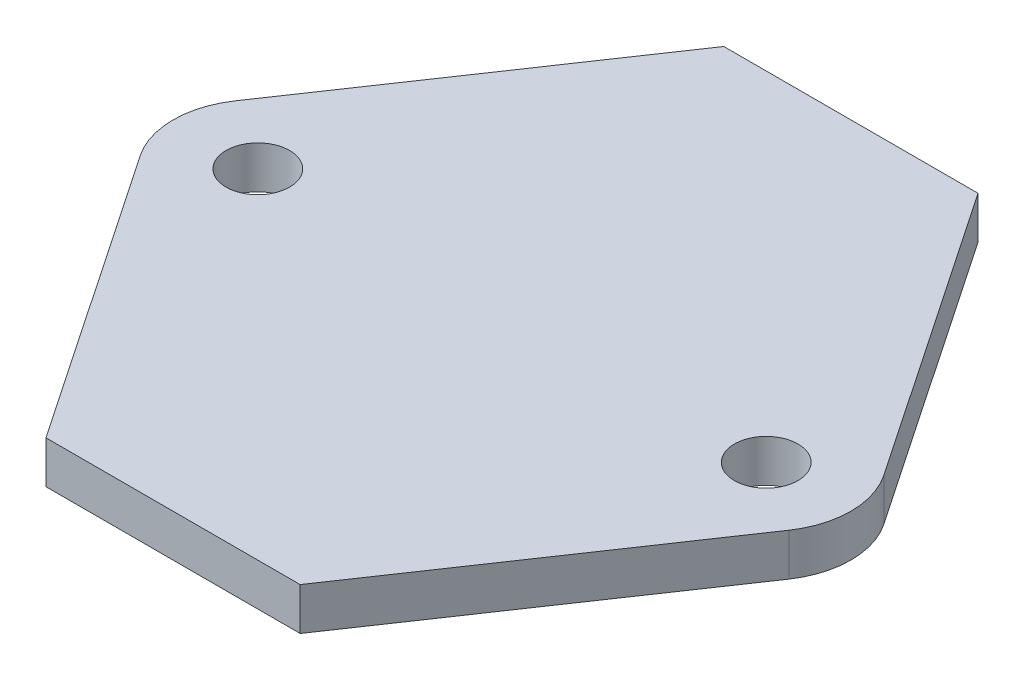
ISO-10303-21;
HEADER;
FILE_DESCRIPTION(('STEP AP214'),'2;1');
FILE_NAME('part.step','',(''),(''),'','','');
FILE_SCHEMA(('AUTOMOTIVE_DESIGN { 1 0 10303 214 1 1 1 1 }'));
ENDSEC;
DATA;
#1=APPLICATION_CONTEXT('core data for automotive mechanical design processes');
#2=APPLICATION_PROTOCOL_DEFINITION('international standard','automotive_design',2000,#1);
#3=PRODUCT_CONTEXT('',#1,'mechanical');
#4=PRODUCT('Part','Part','',(#3));
#5=PRODUCT_RELATED_PRODUCT_CATEGORY('part','',(#4));
#6=PRODUCT_DEFINITION_FORMATION('','',#4);
#7=PRODUCT_DEFINITION_CONTEXT('part definition',#1,'design');
#8=PRODUCT_DEFINITION('design','',#6,#7);
#9=PRODUCT_DEFINITION_SHAPE('','',#8);
#10=(LENGTH_UNIT() NAMED_UNIT(*) SI_UNIT(.MILLI.,.METRE.));
#11=(NAMED_UNIT(*) PLANE_ANGLE_UNIT() SI_UNIT($,.RADIAN.));
#12=(NAMED_UNIT(*) SI_UNIT($,.STERADIAN.) SOLID_ANGLE_UNIT());
#13=UNCERTAINTY_MEASURE_WITH_UNIT(LENGTH_MEASURE(1.E-05),#10,'distance_accuracy_value','');
#14=(GEOMETRIC_REPRESENTATION_CONTEXT(3) GLOBAL_UNCERTAINTY_ASSIGNED_CONTEXT((#13)) GLOBAL_UNIT_ASSIGNED_CONTEXT((#10,
#11,#12)) REPRESENTATION_CONTEXT('',''));
#15=CARTESIAN_POINT('',(0.,0.,0.));
#16=DIRECTION('',(0.,0.,1.));
#17=DIRECTION('',(1.,0.,0.));
#18=AXIS2_PLACEMENT_3D('',#15,#16,#17);
#19=CARTESIAN_POINT('',(0.,1.5875,25.4));
#20=DIRECTION('',(0.,0.,-1.));
#21=DIRECTION('',(-1.,0.,0.));
#22=AXIS2_PLACEMENT_3D('',#19,#20,#21);
#23=PLANE('',#22);
#24=DIRECTION('',(1.,0.,0.));
#25=VECTOR('',#24,1.);
#26=CARTESIAN_POINT('',(0.,-1.5875,25.4));
#27=LINE('',#26,#25);
#28=CARTESIAN_POINT('',(-9.525,-1.5875,25.4));
#29=VERTEX_POINT('',#28);
#30=CARTESIAN_POINT('',(9.525,-1.5875,25.4));
#31=VERTEX_POINT('',#30);
#32=EDGE_CURVE('E139',#29,#31,#27,.T.);
#33=ORIENTED_EDGE('',*,*,#32,.T.);
#34=DIRECTION('',(0.,-1.,0.));
#35=VECTOR('',#34,1.);
#36=CARTESIAN_POINT('',(9.525,1.5875,25.4));
#37=LINE('',#36,#35);
#38=CARTESIAN_POINT('',(9.525,1.5875,25.4));
#39=VERTEX_POINT('',#38);
#40=EDGE_CURVE('E11',#39,#31,#37,.T.);
#41=ORIENTED_EDGE('',*,*,#40,.F.);
#42=DIRECTION('',(1.,0.,0.));
#43=VECTOR('',#42,1.);
#44=CARTESIAN_POINT('',(0.,1.5875,25.4));
#45=LINE('',#44,#43);
#46=CARTESIAN_POINT('',(-9.525,1.5875,25.4));
#47=VERTEX_POINT('',#46);
#48=EDGE_CURVE('E158',#47,#39,#45,.T.);
#49=ORIENTED_EDGE('',*,*,#48,.F.);
#50=DIRECTION('',(0.,-1.,0.));
#51=VECTOR('',#50,1.);
#52=CARTESIAN_POINT('',(-9.525,1.5875,25.4));
#53=LINE('',#52,#51);
#54=EDGE_CURVE('E59',#47,#29,#53,.T.);
#55=ORIENTED_EDGE('',*,*,#54,.T.);
#56=EDGE_LOOP('',(#33,#41,#49,#55));
#57=FACE_BOUND('',#56,.T.);
#58=ADVANCED_FACE('F43',(#57),#23,.F.);
#59=CARTESIAN_POINT('',(18.3228429748059,1.5875,12.4025026796232));
#60=DIRECTION('',(-0.828123163059515,0.,-0.560546186147318));
#61=DIRECTION('',(-0.560546186147318,0.,0.828123163059515));
#62=AXIS2_PLACEMENT_3D('',#59,#60,#61);
#63=PLANE('',#62);
#64=DIRECTION('',(0.560546186147318,0.,-0.828123163059515));
#65=VECTOR('',#64,1.);
#66=CARTESIAN_POINT('',(18.3228429748059,-1.5875,12.4025026796232));
#67=LINE('',#66,#65);
#68=CARTESIAN_POINT('',(24.3085820854279,-1.5875,3.55946828203547));
#69=VERTEX_POINT('',#68);
#70=EDGE_CURVE('E141',#31,#69,#67,.T.);
#71=ORIENTED_EDGE('',*,*,#70,.T.);
#72=DIRECTION('',(0.,-1.,0.));
#73=VECTOR('',#72,1.);
#74=CARTESIAN_POINT('',(24.3085820854279,1.5875,3.55946828203547));
#75=LINE('',#74,#73);
#76=CARTESIAN_POINT('',(24.3085820854279,1.5875,3.55946828203547));
#77=VERTEX_POINT('',#76);
#78=EDGE_CURVE('E51',#77,#69,#75,.T.);
#79=ORIENTED_EDGE('',*,*,#78,.F.);
#80=DIRECTION('',(0.560546186147318,0.,-0.828123163059515));
#81=VECTOR('',#80,1.);
#82=CARTESIAN_POINT('',(18.3228429748059,1.5875,12.4025026796232));
#83=LINE('',#82,#81);
#84=EDGE_CURVE('E97',#39,#77,#83,.T.);
#85=ORIENTED_EDGE('',*,*,#84,.F.);
#86=ORIENTED_EDGE('',*,*,#40,.T.);
#87=EDGE_LOOP('',(#71,#79,#85,#86));
#88=FACE_BOUND('',#87,.T.);
#89=ADVANCED_FACE('F221',(#88),#63,.F.);
#90=CARTESIAN_POINT('',(19.05,1.5875,0.));
#91=DIRECTION('',(0.,-1.,0.));
#92=DIRECTION('',(0.,0.,-1.));
#93=AXIS2_PLACEMENT_3D('',#90,#91,#92);
#94=CYLINDRICAL_SURFACE('',#93,6.35);
#95=CARTESIAN_POINT('',(19.05,-1.5875,0.));
#96=DIRECTION('',(0.,1.,0.));
#97=DIRECTION('',(0.,0.,1.));
#98=AXIS2_PLACEMENT_3D('',#95,#96,#97);
#99=CIRCLE('',#98,6.35);
#100=CARTESIAN_POINT('',(24.3085820854279,-1.5875,-3.55946828203547));
#101=VERTEX_POINT('',#100);
#102=EDGE_CURVE('E144',#69,#101,#99,.T.);
#103=ORIENTED_EDGE('',*,*,#102,.T.);
#104=DIRECTION('',(0.,-1.,0.));
#105=VECTOR('',#104,1.);
#106=CARTESIAN_POINT('',(24.3085820854279,1.5875,-3.55946828203547));
#107=LINE('',#106,#105);
#108=CARTESIAN_POINT('',(24.3085820854279,1.5875,-3.55946828203547));
#109=VERTEX_POINT('',#108);
#110=EDGE_CURVE('E164',#109,#101,#107,.T.);
#111=ORIENTED_EDGE('',*,*,#110,.F.);
#112=CARTESIAN_POINT('',(19.05,1.5875,0.));
#113=DIRECTION('',(0.,1.,0.));
#114=DIRECTION('',(0.,0.,1.));
#115=AXIS2_PLACEMENT_3D('',#112,#113,#114);
#116=CIRCLE('',#115,6.35);
#117=EDGE_CURVE('E172',#77,#109,#116,.T.);
#118=ORIENTED_EDGE('',*,*,#117,.F.);
#119=ORIENTED_EDGE('',*,*,#78,.T.);
#120=EDGE_LOOP('',(#103,#111,#118,#119));
#121=FACE_BOUND('',#120,.T.);
#122=ADVANCED_FACE('F170',(#121),#94,.T.);
#123=CARTESIAN_POINT('',(18.3228429748059,1.5875,-12.4025026796232));
#124=DIRECTION('',(-0.828123163059515,0.,0.560546186147318));
#125=DIRECTION('',(0.560546186147319,0.,0.828123163059515));
#126=AXIS2_PLACEMENT_3D('',#123,#124,#125);
#127=PLANE('',#126);
#128=DIRECTION('',(-0.560546186147318,0.,-0.828123163059515));
#129=VECTOR('',#128,1.);
#130=CARTESIAN_POINT('',(18.3228429748059,-1.5875,-12.4025026796232));
#131=LINE('',#130,#129);
#132=CARTESIAN_POINT('',(9.52499999999999,-1.5875,-25.4));
#133=VERTEX_POINT('',#132);
#134=EDGE_CURVE('E146',#101,#133,#131,.T.);
#135=ORIENTED_EDGE('',*,*,#134,.T.);
#136=DIRECTION('',(0.,-1.,0.));
#137=VECTOR('',#136,1.);
#138=CARTESIAN_POINT('',(9.52499999999999,1.5875,-25.4));
#139=LINE('',#138,#137);
#140=CARTESIAN_POINT('',(9.52499999999999,1.5875,-25.4));
#141=VERTEX_POINT('',#140);
#142=EDGE_CURVE('E162',#141,#133,#139,.T.);
#143=ORIENTED_EDGE('',*,*,#142,.F.);
#144=DIRECTION('',(-0.560546186147318,0.,-0.828123163059515));
#145=VECTOR('',#144,1.);
#146=CARTESIAN_POINT('',(18.3228429748059,1.5875,-12.4025026796232));
#147=LINE('',#146,#145);
#148=EDGE_CURVE('E181',#109,#141,#147,.T.);
#149=ORIENTED_EDGE('',*,*,#148,.F.);
#150=ORIENTED_EDGE('',*,*,#110,.T.);
#151=EDGE_LOOP('',(#135,#143,#149,#150));
#152=FACE_BOUND('',#151,.T.);
#153=ADVANCED_FACE('F179',(#152),#127,.F.);
#154=CARTESIAN_POINT('',(0.,1.5875,-25.4));
#155=DIRECTION('',(0.,0.,-1.));
#156=DIRECTION('',(-1.,0.,0.));
#157=AXIS2_PLACEMENT_3D('',#154,#155,#156);
#158=PLANE('',#157);
#159=DIRECTION('',(1.,0.,0.));
#160=VECTOR('',#159,1.);
#161=CARTESIAN_POINT('',(0.,-1.5875,-25.4));
#162=LINE('',#161,#160);
#163=CARTESIAN_POINT('',(-9.52500000000001,-1.5875,-25.4));
#164=VERTEX_POINT('',#163);
#165=EDGE_CURVE('E149',#164,#133,#162,.T.);
#166=ORIENTED_EDGE('',*,*,#165,.F.);
#167=DIRECTION('',(0.,-1.,0.));
#168=VECTOR('',#167,1.);
#169=CARTESIAN_POINT('',(-9.52500000000001,1.5875,-25.4));
#170=LINE('',#169,#168);
#171=CARTESIAN_POINT('',(-9.52500000000001,1.5875,-25.4));
#172=VERTEX_POINT('',#171);
#173=EDGE_CURVE('E122',#172,#164,#170,.T.);
#174=ORIENTED_EDGE('',*,*,#173,.F.);
#175=DIRECTION('',(1.,0.,0.));
#176=VECTOR('',#175,1.);
#177=CARTESIAN_POINT('',(0.,1.5875,-25.4));
#178=LINE('',#177,#176);
#179=EDGE_CURVE('E131',#172,#141,#178,.T.);
#180=ORIENTED_EDGE('',*,*,#179,.T.);
#181=ORIENTED_EDGE('',*,*,#142,.T.);
#182=EDGE_LOOP('',(#166,#174,#180,#181));
#183=FACE_BOUND('',#182,.T.);
#184=ADVANCED_FACE('F235',(#183),#158,.T.);
#185=CARTESIAN_POINT('',(-18.3228429748059,1.5875,-12.4025026796232));
#186=DIRECTION('',(-0.828123163059515,0.,-0.560546186147318));
#187=DIRECTION('',(-0.560546186147318,0.,0.828123163059515));
#188=AXIS2_PLACEMENT_3D('',#185,#186,#187);
#189=PLANE('',#188);
#190=DIRECTION('',(0.560546186147318,0.,-0.828123163059515));
#191=VECTOR('',#190,1.);
#192=CARTESIAN_POINT('',(-18.3228429748059,-1.5875,-12.4025026796232));
#193=LINE('',#192,#191);
#194=CARTESIAN_POINT('',(-24.3085820854279,-1.5875,-3.55946828203547));
#195=VERTEX_POINT('',#194);
#196=EDGE_CURVE('E118',#195,#164,#193,.T.);
#197=ORIENTED_EDGE('',*,*,#196,.F.);
#198=DIRECTION('',(0.,-1.,0.));
#199=VECTOR('',#198,1.);
#200=CARTESIAN_POINT('',(-24.3085820854279,1.5875,-3.55946828203547));
#201=LINE('',#200,#199);
#202=CARTESIAN_POINT('',(-24.3085820854279,1.5875,-3.55946828203547));
#203=VERTEX_POINT('',#202);
#204=EDGE_CURVE('E113',#203,#195,#201,.T.);
#205=ORIENTED_EDGE('',*,*,#204,.F.);
#206=DIRECTION('',(0.560546186147318,0.,-0.828123163059515));
#207=VECTOR('',#206,1.);
#208=CARTESIAN_POINT('',(-18.3228429748059,1.5875,-12.4025026796232));
#209=LINE('',#208,#207);
#210=EDGE_CURVE('E116',#203,#172,#209,.T.);
#211=ORIENTED_EDGE('',*,*,#210,.T.);
#212=ORIENTED_EDGE('',*,*,#173,.T.);
#213=EDGE_LOOP('',(#197,#205,#211,#212));
#214=FACE_BOUND('',#213,.T.);
#215=ADVANCED_FACE('F115',(#214),#189,.T.);
#216=CARTESIAN_POINT('',(-19.05,1.5875,0.));
#217=DIRECTION('',(0.,-1.,0.));
#218=DIRECTION('',(0.,0.,-1.));
#219=AXIS2_PLACEMENT_3D('',#216,#217,#218);
#220=CYLINDRICAL_SURFACE('',#219,6.35);
#221=CARTESIAN_POINT('',(-19.05,-1.5875,0.));
#222=DIRECTION('',(0.,1.,0.));
#223=DIRECTION('',(0.,0.,1.));
#224=AXIS2_PLACEMENT_3D('',#221,#222,#223);
#225=CIRCLE('',#224,6.35);
#226=CARTESIAN_POINT('',(-24.3085820854279,-1.5875,3.55946828203547));
#227=VERTEX_POINT('',#226);
#228=EDGE_CURVE('E153',#227,#195,#225,.F.);
#229=ORIENTED_EDGE('',*,*,#228,.F.);
#230=DIRECTION('',(0.,-1.,0.));
#231=VECTOR('',#230,1.);
#232=CARTESIAN_POINT('',(-24.3085820854279,1.5875,3.55946828203547));
#233=LINE('',#232,#231);
#234=CARTESIAN_POINT('',(-24.3085820854279,1.5875,3.55946828203547));
#235=VERTEX_POINT('',#234);
#236=EDGE_CURVE('E85',#235,#227,#233,.T.);
#237=ORIENTED_EDGE('',*,*,#236,.F.);
#238=CARTESIAN_POINT('',(-19.05,1.5875,0.));
#239=DIRECTION('',(0.,1.,0.));
#240=DIRECTION('',(0.,0.,1.));
#241=AXIS2_PLACEMENT_3D('',#238,#239,#240);
#242=CIRCLE('',#241,6.35);
#243=EDGE_CURVE('E129',#235,#203,#242,.F.);
#244=ORIENTED_EDGE('',*,*,#243,.T.);
#245=ORIENTED_EDGE('',*,*,#204,.T.);
#246=EDGE_LOOP('',(#229,#237,#244,#245));
#247=FACE_BOUND('',#246,.T.);
#248=ADVANCED_FACE('F133',(#247),#220,.T.);
#249=CARTESIAN_POINT('',(-18.3228429748059,1.5875,12.4025026796232));
#250=DIRECTION('',(-0.828123163059515,0.,0.560546186147318));
#251=DIRECTION('',(0.560546186147318,0.,0.828123163059515));
#252=AXIS2_PLACEMENT_3D('',#249,#250,#251);
#253=PLANE('',#252);
#254=DIRECTION('',(-0.560546186147318,0.,-0.828123163059515));
#255=VECTOR('',#254,1.);
#256=CARTESIAN_POINT('',(-18.3228429748059,-1.5875,12.4025026796232));
#257=LINE('',#256,#255);
#258=EDGE_CURVE('E155',#29,#227,#257,.T.);
#259=ORIENTED_EDGE('',*,*,#258,.F.);
#260=ORIENTED_EDGE('',*,*,#54,.F.);
#261=DIRECTION('',(-0.560546186147318,0.,-0.828123163059515));
#262=VECTOR('',#261,1.);
#263=CARTESIAN_POINT('',(-18.3228429748059,1.5875,12.4025026796232));
#264=LINE('',#263,#262);
#265=EDGE_CURVE('E134',#47,#235,#264,.T.);
#266=ORIENTED_EDGE('',*,*,#265,.T.);
#267=ORIENTED_EDGE('',*,*,#236,.T.);
#268=EDGE_LOOP('',(#259,#260,#266,#267));
#269=FACE_BOUND('',#268,.T.);
#270=ADVANCED_FACE('F203',(#269),#253,.T.);
#271=CARTESIAN_POINT('',(0.,1.5875,0.));
#272=DIRECTION('',(0.,1.,0.));
#273=DIRECTION('',(0.,0.,1.));
#274=AXIS2_PLACEMENT_3D('',#271,#272,#273);
#275=PLANE('',#274);
#276=CARTESIAN_POINT('',(19.05,1.5875,0.));
#277=DIRECTION('',(0.,1.,0.));
#278=DIRECTION('',(0.,0.,1.));
#279=AXIS2_PLACEMENT_3D('',#276,#277,#278);
#280=CIRCLE('',#279,2.38125);
#281=CARTESIAN_POINT('',(19.05,1.5875,2.38125));
#282=VERTEX_POINT('',#281);
#283=EDGE_CURVE('E195',#282,#282,#280,.T.);
#284=ORIENTED_EDGE('',*,*,#283,.F.);
#285=EDGE_LOOP('',(#284));
#286=FACE_BOUND('',#285,.T.);
#287=CARTESIAN_POINT('',(-19.05,1.5875,0.));
#288=DIRECTION('',(0.,1.,0.));
#289=DIRECTION('',(0.,0.,1.));
#290=AXIS2_PLACEMENT_3D('',#287,#288,#289);
#291=CIRCLE('',#290,2.38125);
#292=CARTESIAN_POINT('',(-19.05,1.5875,2.38125));
#293=VERTEX_POINT('',#292);
#294=EDGE_CURVE('E189',#293,#293,#291,.T.);
#295=ORIENTED_EDGE('',*,*,#294,.F.);
#296=EDGE_LOOP('',(#295));
#297=FACE_BOUND('',#296,.T.);
#298=ORIENTED_EDGE('',*,*,#48,.T.);
#299=ORIENTED_EDGE('',*,*,#84,.T.);
#300=ORIENTED_EDGE('',*,*,#117,.T.);
#301=ORIENTED_EDGE('',*,*,#148,.T.);
#302=ORIENTED_EDGE('',*,*,#179,.F.);
#303=ORIENTED_EDGE('',*,*,#210,.F.);
#304=ORIENTED_EDGE('',*,*,#243,.F.);
#305=ORIENTED_EDGE('',*,*,#265,.F.);
#306=EDGE_LOOP('',(#298,#299,#300,#301,#302,#303,#304,#305));
#307=FACE_BOUND('',#306,.T.);
#308=ADVANCED_FACE('F127',(#286,#297,#307),#275,.T.);
#309=CARTESIAN_POINT('',(0.,-1.5875,0.));
#310=DIRECTION('',(0.,1.,0.));
#311=DIRECTION('',(0.,0.,1.));
#312=AXIS2_PLACEMENT_3D('',#309,#310,#311);
#313=PLANE('',#312);
#314=CARTESIAN_POINT('',(19.05,-1.5875,0.));
#315=DIRECTION('',(0.,1.,0.));
#316=DIRECTION('',(0.,0.,1.));
#317=AXIS2_PLACEMENT_3D('',#314,#315,#316);
#318=CIRCLE('',#317,2.38125);
#319=CARTESIAN_POINT('',(19.05,-1.5875,2.38125));
#320=VERTEX_POINT('',#319);
#321=EDGE_CURVE('E192',#320,#320,#318,.T.);
#322=ORIENTED_EDGE('',*,*,#321,.T.);
#323=EDGE_LOOP('',(#322));
#324=FACE_BOUND('',#323,.T.);
#325=CARTESIAN_POINT('',(-19.05,-1.5875,0.));
#326=DIRECTION('',(0.,1.,0.));
#327=DIRECTION('',(0.,0.,1.));
#328=AXIS2_PLACEMENT_3D('',#325,#326,#327);
#329=CIRCLE('',#328,2.38125);
#330=CARTESIAN_POINT('',(-19.05,-1.5875,2.38125));
#331=VERTEX_POINT('',#330);
#332=EDGE_CURVE('E142',#331,#331,#329,.T.);
#333=ORIENTED_EDGE('',*,*,#332,.T.);
#334=EDGE_LOOP('',(#333));
#335=FACE_BOUND('',#334,.T.);
#336=ORIENTED_EDGE('',*,*,#32,.F.);
#337=ORIENTED_EDGE('',*,*,#258,.T.);
#338=ORIENTED_EDGE('',*,*,#228,.T.);
#339=ORIENTED_EDGE('',*,*,#196,.T.);
#340=ORIENTED_EDGE('',*,*,#165,.T.);
#341=ORIENTED_EDGE('',*,*,#134,.F.);
#342=ORIENTED_EDGE('',*,*,#102,.F.);
#343=ORIENTED_EDGE('',*,*,#70,.F.);
#344=EDGE_LOOP('',(#336,#337,#338,#339,#340,#341,#342,#343));
#345=FACE_BOUND('',#344,.T.);
#346=ADVANCED_FACE('F175',(#324,#335,#345),#313,.F.);
#347=CARTESIAN_POINT('',(-19.05,1.5875,0.));
#348=DIRECTION('',(0.,1.,0.));
#349=DIRECTION('',(0.,0.,1.));
#350=AXIS2_PLACEMENT_3D('',#347,#348,#349);
#351=CYLINDRICAL_SURFACE('',#350,2.38125);
#352=ORIENTED_EDGE('',*,*,#332,.F.);
#353=EDGE_LOOP('',(#352));
#354=FACE_BOUND('',#353,.T.);
#355=ORIENTED_EDGE('',*,*,#294,.T.);
#356=EDGE_LOOP('',(#355));
#357=FACE_BOUND('',#356,.T.);
#358=ADVANCED_FACE('F207',(#354,#357),#351,.F.);
#359=CARTESIAN_POINT('',(19.05,1.5875,0.));
#360=DIRECTION('',(0.,1.,0.));
#361=DIRECTION('',(0.,0.,1.));
#362=AXIS2_PLACEMENT_3D('',#359,#360,#361);
#363=CYLINDRICAL_SURFACE('',#362,2.38125);
#364=ORIENTED_EDGE('',*,*,#321,.F.);
#365=EDGE_LOOP('',(#364));
#366=FACE_BOUND('',#365,.T.);
#367=ORIENTED_EDGE('',*,*,#283,.T.);
#368=EDGE_LOOP('',(#367));
#369=FACE_BOUND('',#368,.T.);
#370=ADVANCED_FACE('F199',(#366,#369),#363,.F.);
#371=CLOSED_SHELL('',(#58,#89,#122,#153,#184,#215,#248,#270,#308,#346,#358,#370));
#372=MANIFOLD_SOLID_BREP('B2',#371);
#373=ADVANCED_BREP_SHAPE_REPRESENTATION('',(#18,#372),#14);
#374=SHAPE_DEFINITION_REPRESENTATION(#9,#373);
ENDSEC;
END-ISO-10303-21;
